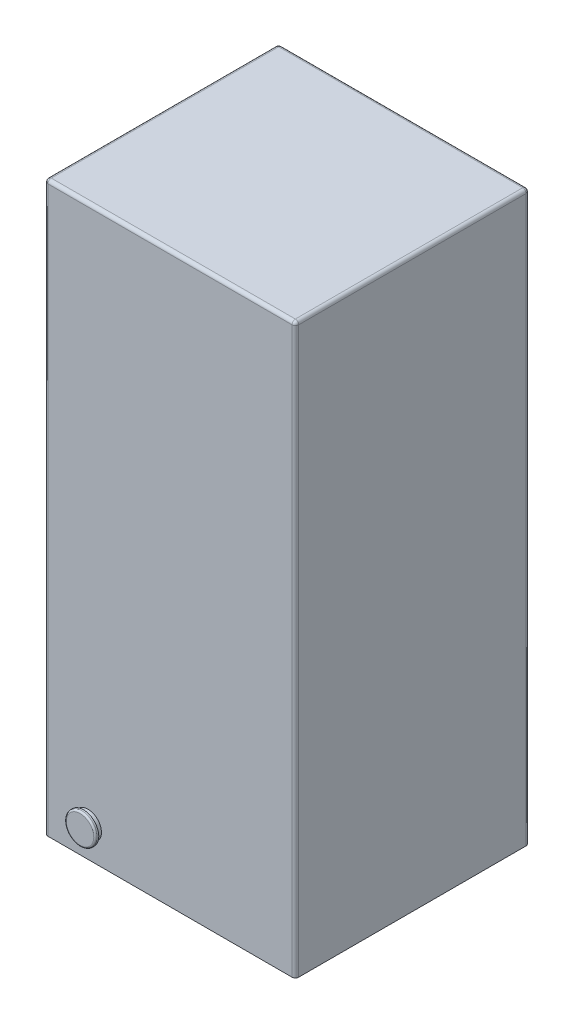
ISO-10303-21;
HEADER;
FILE_DESCRIPTION(('STEP AP214'),'2;1');
FILE_NAME('part.step','',(''),(''),'','','');
FILE_SCHEMA(('AUTOMOTIVE_DESIGN { 1 0 10303 214 1 1 1 1 }'));
ENDSEC;
DATA;
#1=APPLICATION_CONTEXT('core data for automotive mechanical design processes');
#2=APPLICATION_PROTOCOL_DEFINITION('international standard','automotive_design',2000,#1);
#3=PRODUCT_CONTEXT('',#1,'mechanical');
#4=PRODUCT('Part','Part','',(#3));
#5=PRODUCT_RELATED_PRODUCT_CATEGORY('part','',(#4));
#6=PRODUCT_DEFINITION_FORMATION('','',#4);
#7=PRODUCT_DEFINITION_CONTEXT('part definition',#1,'design');
#8=PRODUCT_DEFINITION('design','',#6,#7);
#9=PRODUCT_DEFINITION_SHAPE('','',#8);
#10=(LENGTH_UNIT() NAMED_UNIT(*) SI_UNIT(.MILLI.,.METRE.));
#11=(NAMED_UNIT(*) PLANE_ANGLE_UNIT() SI_UNIT($,.RADIAN.));
#12=(NAMED_UNIT(*) SI_UNIT($,.STERADIAN.) SOLID_ANGLE_UNIT());
#13=UNCERTAINTY_MEASURE_WITH_UNIT(LENGTH_MEASURE(1.E-05),#10,'distance_accuracy_value','');
#14=(GEOMETRIC_REPRESENTATION_CONTEXT(3) GLOBAL_UNCERTAINTY_ASSIGNED_CONTEXT((#13)) GLOBAL_UNIT_ASSIGNED_CONTEXT((#10,
#11,#12)) REPRESENTATION_CONTEXT('',''));
#15=CARTESIAN_POINT('',(0.,0.,0.));
#16=DIRECTION('',(0.,0.,1.));
#17=DIRECTION('',(1.,0.,0.));
#18=AXIS2_PLACEMENT_3D('',#15,#16,#17);
#19=CARTESIAN_POINT('',(130.,-1610.,724.));
#20=DIRECTION('',(0.,0.,-1.));
#21=DIRECTION('',(-1.,0.,0.));
#22=AXIS2_PLACEMENT_3D('',#19,#20,#21);
#23=CYLINDRICAL_SURFACE('',#22,40.);
#24=CARTESIAN_POINT('',(130.,-1610.,700.));
#25=DIRECTION('',(0.,0.,1.));
#26=DIRECTION('',(1.,0.,0.));
#27=AXIS2_PLACEMENT_3D('',#24,#25,#26);
#28=CIRCLE('',#27,40.);
#29=CARTESIAN_POINT('',(170.,-1610.,700.));
#30=VERTEX_POINT('',#29);
#31=EDGE_CURVE('E177',#30,#30,#28,.T.);
#32=ORIENTED_EDGE('',*,*,#31,.T.);
#33=EDGE_LOOP('',(#32));
#34=FACE_BOUND('',#33,.T.);
#35=CARTESIAN_POINT('',(130.,-1610.,714.));
#36=DIRECTION('',(0.,0.,1.));
#37=DIRECTION('',(1.,0.,0.));
#38=AXIS2_PLACEMENT_3D('',#35,#36,#37);
#39=CIRCLE('',#38,40.);
#40=CARTESIAN_POINT('',(170.,-1610.,714.));
#41=VERTEX_POINT('',#40);
#42=EDGE_CURVE('E172',#41,#41,#39,.T.);
#43=ORIENTED_EDGE('',*,*,#42,.F.);
#44=EDGE_LOOP('',(#43));
#45=FACE_BOUND('',#44,.T.);
#46=ADVANCED_FACE('F36',(#34,#45),#23,.T.);
#47=CARTESIAN_POINT('',(0.,0.,700.));
#48=DIRECTION('',(1.,0.,0.));
#49=DIRECTION('',(0.,1.,0.));
#50=AXIS2_PLACEMENT_3D('',#47,#48,#49);
#51=PLANE('',#50);
#52=DIRECTION('',(0.,0.,-1.));
#53=VECTOR('',#52,1.);
#54=CARTESIAN_POINT('',(0.,-10.,700.));
#55=LINE('',#54,#53);
#56=CARTESIAN_POINT('',(0.,-10.,690.));
#57=VERTEX_POINT('',#56);
#58=CARTESIAN_POINT('',(0.,-10.,10.));
#59=VERTEX_POINT('',#58);
#60=EDGE_CURVE('E137',#57,#59,#55,.T.);
#61=ORIENTED_EDGE('',*,*,#60,.T.);
#62=DIRECTION('',(0.,-1.,0.));
#63=VECTOR('',#62,1.);
#64=CARTESIAN_POINT('',(0.,0.,10.));
#65=LINE('',#64,#63);
#66=CARTESIAN_POINT('',(2.0818995585505E-13,-1700.,10.));
#67=VERTEX_POINT('',#66);
#68=EDGE_CURVE('E130',#59,#67,#65,.T.);
#69=ORIENTED_EDGE('',*,*,#68,.T.);
#70=DIRECTION('',(0.,0.,-1.));
#71=VECTOR('',#70,1.);
#72=CARTESIAN_POINT('',(2.0818995585505E-13,-1700.,700.));
#73=LINE('',#72,#71);
#74=CARTESIAN_POINT('',(2.0818995585505E-13,-1700.,690.));
#75=VERTEX_POINT('',#74);
#76=EDGE_CURVE('E117',#75,#67,#73,.T.);
#77=ORIENTED_EDGE('',*,*,#76,.F.);
#78=DIRECTION('',(0.,-1.,0.));
#79=VECTOR('',#78,1.);
#80=CARTESIAN_POINT('',(0.,0.,690.));
#81=LINE('',#80,#79);
#82=EDGE_CURVE('E127',#75,#57,#81,.F.);
#83=ORIENTED_EDGE('',*,*,#82,.T.);
#84=EDGE_LOOP('',(#61,#69,#77,#83));
#85=FACE_BOUND('',#84,.T.);
#86=ADVANCED_FACE('F126',(#85),#51,.F.);
#87=CARTESIAN_POINT('',(2.0818995585505E-13,-1700.,700.));
#88=DIRECTION('',(0.,1.,0.));
#89=DIRECTION('',(0.,0.,1.));
#90=AXIS2_PLACEMENT_3D('',#87,#88,#89);
#91=PLANE('',#90);
#92=ORIENTED_EDGE('',*,*,#76,.T.);
#93=CARTESIAN_POINT('',(10.0000000000002,-1700.,10.));
#94=DIRECTION('',(0.,1.,0.));
#95=DIRECTION('',(0.,0.,1.));
#96=AXIS2_PLACEMENT_3D('',#93,#94,#95);
#97=CIRCLE('',#96,10.);
#98=CARTESIAN_POINT('',(10.0000000000002,-1700.,0.));
#99=VERTEX_POINT('',#98);
#100=EDGE_CURVE('E145',#67,#99,#97,.F.);
#101=ORIENTED_EDGE('',*,*,#100,.T.);
#102=DIRECTION('',(1.,0.,0.));
#103=VECTOR('',#102,1.);
#104=CARTESIAN_POINT('',(2.0818995585505E-13,-1700.,0.));
#105=LINE('',#104,#103);
#106=CARTESIAN_POINT('',(740.,-1700.,0.));
#107=VERTEX_POINT('',#106);
#108=EDGE_CURVE('E207',#99,#107,#105,.T.);
#109=ORIENTED_EDGE('',*,*,#108,.T.);
#110=CARTESIAN_POINT('',(740.,-1700.,10.));
#111=DIRECTION('',(0.,1.,0.));
#112=DIRECTION('',(0.,0.,1.));
#113=AXIS2_PLACEMENT_3D('',#110,#111,#112);
#114=CIRCLE('',#113,10.);
#115=CARTESIAN_POINT('',(750.,-1700.,10.));
#116=VERTEX_POINT('',#115);
#117=EDGE_CURVE('E121',#107,#116,#114,.F.);
#118=ORIENTED_EDGE('',*,*,#117,.T.);
#119=DIRECTION('',(0.,0.,-1.));
#120=VECTOR('',#119,1.);
#121=CARTESIAN_POINT('',(750.,-1700.,700.));
#122=LINE('',#121,#120);
#123=CARTESIAN_POINT('',(750.,-1700.,690.));
#124=VERTEX_POINT('',#123);
#125=EDGE_CURVE('E131',#124,#116,#122,.T.);
#126=ORIENTED_EDGE('',*,*,#125,.F.);
#127=CARTESIAN_POINT('',(740.,-1700.,690.));
#128=DIRECTION('',(0.,1.,0.));
#129=DIRECTION('',(0.,0.,1.));
#130=AXIS2_PLACEMENT_3D('',#127,#128,#129);
#131=CIRCLE('',#130,10.);
#132=CARTESIAN_POINT('',(740.,-1700.,700.));
#133=VERTEX_POINT('',#132);
#134=EDGE_CURVE('E122',#124,#133,#131,.F.);
#135=ORIENTED_EDGE('',*,*,#134,.T.);
#136=DIRECTION('',(1.,0.,0.));
#137=VECTOR('',#136,1.);
#138=CARTESIAN_POINT('',(2.0818995585505E-13,-1700.,700.));
#139=LINE('',#138,#137);
#140=CARTESIAN_POINT('',(10.0000000000002,-1700.,700.));
#141=VERTEX_POINT('',#140);
#142=EDGE_CURVE('E118',#141,#133,#139,.T.);
#143=ORIENTED_EDGE('',*,*,#142,.F.);
#144=CARTESIAN_POINT('',(10.0000000000002,-1700.,690.));
#145=DIRECTION('',(0.,1.,0.));
#146=DIRECTION('',(0.,0.,1.));
#147=AXIS2_PLACEMENT_3D('',#144,#145,#146);
#148=CIRCLE('',#147,10.);
#149=EDGE_CURVE('E114',#141,#75,#148,.F.);
#150=ORIENTED_EDGE('',*,*,#149,.T.);
#151=EDGE_LOOP('',(#92,#101,#109,#118,#126,#135,#143,#150));
#152=FACE_BOUND('',#151,.T.);
#153=ADVANCED_FACE('F116',(#152),#91,.F.);
#154=CARTESIAN_POINT('',(750.,0.,700.));
#155=DIRECTION('',(-1.,0.,0.));
#156=DIRECTION('',(0.,-1.,0.));
#157=AXIS2_PLACEMENT_3D('',#154,#155,#156);
#158=PLANE('',#157);
#159=ORIENTED_EDGE('',*,*,#125,.T.);
#160=DIRECTION('',(0.,1.,0.));
#161=VECTOR('',#160,1.);
#162=CARTESIAN_POINT('',(750.,0.,10.));
#163=LINE('',#162,#161);
#164=CARTESIAN_POINT('',(750.,-10.,10.));
#165=VERTEX_POINT('',#164);
#166=EDGE_CURVE('E166',#116,#165,#163,.T.);
#167=ORIENTED_EDGE('',*,*,#166,.T.);
#168=DIRECTION('',(0.,0.,-1.));
#169=VECTOR('',#168,1.);
#170=CARTESIAN_POINT('',(750.,-10.,700.));
#171=LINE('',#170,#169);
#172=CARTESIAN_POINT('',(750.,-10.,690.));
#173=VERTEX_POINT('',#172);
#174=EDGE_CURVE('E164',#165,#173,#171,.F.);
#175=ORIENTED_EDGE('',*,*,#174,.T.);
#176=DIRECTION('',(0.,1.,0.));
#177=VECTOR('',#176,1.);
#178=CARTESIAN_POINT('',(750.,-1700.,690.));
#179=LINE('',#178,#177);
#180=EDGE_CURVE('E162',#173,#124,#179,.F.);
#181=ORIENTED_EDGE('',*,*,#180,.T.);
#182=EDGE_LOOP('',(#159,#167,#175,#181));
#183=FACE_BOUND('',#182,.T.);
#184=ADVANCED_FACE('F245',(#183),#158,.F.);
#185=CARTESIAN_POINT('',(0.,0.,700.));
#186=DIRECTION('',(0.,-1.,0.));
#187=DIRECTION('',(0.,0.,-1.));
#188=AXIS2_PLACEMENT_3D('',#185,#186,#187);
#189=PLANE('',#188);
#190=DIRECTION('',(0.,0.,-1.));
#191=VECTOR('',#190,1.);
#192=CARTESIAN_POINT('',(740.,0.,700.));
#193=LINE('',#192,#191);
#194=CARTESIAN_POINT('',(740.,0.,690.));
#195=VERTEX_POINT('',#194);
#196=CARTESIAN_POINT('',(740.,0.,10.));
#197=VERTEX_POINT('',#196);
#198=EDGE_CURVE('E153',#195,#197,#193,.T.);
#199=ORIENTED_EDGE('',*,*,#198,.T.);
#200=DIRECTION('',(-1.,0.,0.));
#201=VECTOR('',#200,1.);
#202=CARTESIAN_POINT('',(0.,0.,10.));
#203=LINE('',#202,#201);
#204=CARTESIAN_POINT('',(10.,0.,10.));
#205=VERTEX_POINT('',#204);
#206=EDGE_CURVE('E159',#197,#205,#203,.T.);
#207=ORIENTED_EDGE('',*,*,#206,.T.);
#208=DIRECTION('',(0.,0.,-1.));
#209=VECTOR('',#208,1.);
#210=CARTESIAN_POINT('',(10.,0.,700.));
#211=LINE('',#210,#209);
#212=CARTESIAN_POINT('',(10.,0.,690.));
#213=VERTEX_POINT('',#212);
#214=EDGE_CURVE('E157',#205,#213,#211,.F.);
#215=ORIENTED_EDGE('',*,*,#214,.T.);
#216=DIRECTION('',(-1.,0.,0.));
#217=VECTOR('',#216,1.);
#218=CARTESIAN_POINT('',(750.,0.,690.));
#219=LINE('',#218,#217);
#220=EDGE_CURVE('E155',#213,#195,#219,.F.);
#221=ORIENTED_EDGE('',*,*,#220,.T.);
#222=EDGE_LOOP('',(#199,#207,#215,#221));
#223=FACE_BOUND('',#222,.T.);
#224=ADVANCED_FACE('F237',(#223),#189,.F.);
#225=CARTESIAN_POINT('',(0.,0.,700.));
#226=DIRECTION('',(0.,0.,1.));
#227=DIRECTION('',(1.,0.,0.));
#228=AXIS2_PLACEMENT_3D('',#225,#226,#227);
#229=PLANE('',#228);
#230=ORIENTED_EDGE('',*,*,#31,.F.);
#231=EDGE_LOOP('',(#230));
#232=FACE_BOUND('',#231,.T.);
#233=DIRECTION('',(-1.,0.,0.));
#234=VECTOR('',#233,1.);
#235=CARTESIAN_POINT('',(0.,-10.,700.));
#236=LINE('',#235,#234);
#237=CARTESIAN_POINT('',(740.,-10.,700.));
#238=VERTEX_POINT('',#237);
#239=CARTESIAN_POINT('',(10.,-10.,700.));
#240=VERTEX_POINT('',#239);
#241=EDGE_CURVE('E51',#238,#240,#236,.T.);
#242=ORIENTED_EDGE('',*,*,#241,.T.);
#243=DIRECTION('',(0.,-1.,0.));
#244=VECTOR('',#243,1.);
#245=CARTESIAN_POINT('',(10.0000000000002,-1700.,700.));
#246=LINE('',#245,#244);
#247=EDGE_CURVE('E170',#240,#141,#246,.T.);
#248=ORIENTED_EDGE('',*,*,#247,.T.);
#249=ORIENTED_EDGE('',*,*,#142,.T.);
#250=DIRECTION('',(0.,1.,0.));
#251=VECTOR('',#250,1.);
#252=CARTESIAN_POINT('',(740.,0.,700.));
#253=LINE('',#252,#251);
#254=EDGE_CURVE('E56',#133,#238,#253,.T.);
#255=ORIENTED_EDGE('',*,*,#254,.T.);
#256=EDGE_LOOP('',(#242,#248,#249,#255));
#257=FACE_BOUND('',#256,.T.);
#258=ADVANCED_FACE('F233',(#232,#257),#229,.T.);
#259=CARTESIAN_POINT('',(0.,0.,0.));
#260=DIRECTION('',(0.,0.,1.));
#261=DIRECTION('',(1.,0.,0.));
#262=AXIS2_PLACEMENT_3D('',#259,#260,#261);
#263=PLANE('',#262);
#264=ORIENTED_EDGE('',*,*,#108,.F.);
#265=DIRECTION('',(0.,-1.,0.));
#266=VECTOR('',#265,1.);
#267=CARTESIAN_POINT('',(10.,0.,0.));
#268=LINE('',#267,#266);
#269=CARTESIAN_POINT('',(10.,-10.,0.));
#270=VERTEX_POINT('',#269);
#271=EDGE_CURVE('E151',#99,#270,#268,.F.);
#272=ORIENTED_EDGE('',*,*,#271,.T.);
#273=DIRECTION('',(-1.,0.,0.));
#274=VECTOR('',#273,1.);
#275=CARTESIAN_POINT('',(0.,-10.,0.));
#276=LINE('',#275,#274);
#277=CARTESIAN_POINT('',(740.,-10.,0.));
#278=VERTEX_POINT('',#277);
#279=EDGE_CURVE('E149',#270,#278,#276,.F.);
#280=ORIENTED_EDGE('',*,*,#279,.T.);
#281=DIRECTION('',(0.,1.,0.));
#282=VECTOR('',#281,1.);
#283=CARTESIAN_POINT('',(740.,0.,0.));
#284=LINE('',#283,#282);
#285=EDGE_CURVE('E147',#278,#107,#284,.F.);
#286=ORIENTED_EDGE('',*,*,#285,.T.);
#287=EDGE_LOOP('',(#264,#272,#280,#286));
#288=FACE_BOUND('',#287,.T.);
#289=ADVANCED_FACE('F236',(#288),#263,.F.);
#290=CARTESIAN_POINT('',(740.,0.,690.));
#291=DIRECTION('',(0.,-1.,0.));
#292=DIRECTION('',(1.,0.,0.));
#293=AXIS2_PLACEMENT_3D('',#290,#291,#292);
#294=CYLINDRICAL_SURFACE('',#293,10.);
#295=CARTESIAN_POINT('',(740.,-10.,690.));
#296=DIRECTION('',(0.,1.,0.));
#297=DIRECTION('',(-1.,0.,0.));
#298=AXIS2_PLACEMENT_3D('',#295,#296,#297);
#299=CIRCLE('',#298,10.);
#300=EDGE_CURVE('E204',#238,#173,#299,.T.);
#301=ORIENTED_EDGE('',*,*,#300,.F.);
#302=ORIENTED_EDGE('',*,*,#254,.F.);
#303=ORIENTED_EDGE('',*,*,#134,.F.);
#304=ORIENTED_EDGE('',*,*,#180,.F.);
#305=EDGE_LOOP('',(#301,#302,#303,#304));
#306=FACE_BOUND('',#305,.T.);
#307=ADVANCED_FACE('F241',(#306),#294,.T.);
#308=CARTESIAN_POINT('',(740.,-10.,690.));
#309=DIRECTION('',(0.,0.,1.));
#310=DIRECTION('',(1.,0.,0.));
#311=AXIS2_PLACEMENT_3D('',#308,#309,#310);
#312=SPHERICAL_SURFACE('',#311,10.);
#313=CARTESIAN_POINT('',(740.,-10.,690.));
#314=DIRECTION('',(1.,0.,0.));
#315=DIRECTION('',(0.,0.,-1.));
#316=AXIS2_PLACEMENT_3D('',#313,#314,#315);
#317=CIRCLE('',#316,10.);
#318=EDGE_CURVE('E198',#238,#195,#317,.F.);
#319=ORIENTED_EDGE('',*,*,#318,.F.);
#320=ORIENTED_EDGE('',*,*,#300,.T.);
#321=CARTESIAN_POINT('',(740.,-10.,690.));
#322=DIRECTION('',(0.,0.,1.));
#323=DIRECTION('',(1.,0.,0.));
#324=AXIS2_PLACEMENT_3D('',#321,#322,#323);
#325=CIRCLE('',#324,10.);
#326=EDGE_CURVE('E201',#195,#173,#325,.F.);
#327=ORIENTED_EDGE('',*,*,#326,.F.);
#328=EDGE_LOOP('',(#319,#320,#327));
#329=FACE_BOUND('',#328,.T.);
#330=ADVANCED_FACE('F290',(#329),#312,.T.);
#331=CARTESIAN_POINT('',(740.,0.,10.));
#332=DIRECTION('',(0.,1.,0.));
#333=DIRECTION('',(-1.,0.,0.));
#334=AXIS2_PLACEMENT_3D('',#331,#332,#333);
#335=CYLINDRICAL_SURFACE('',#334,10.);
#336=ORIENTED_EDGE('',*,*,#117,.F.);
#337=ORIENTED_EDGE('',*,*,#285,.F.);
#338=CARTESIAN_POINT('',(740.,-10.,10.));
#339=DIRECTION('',(0.,1.,0.));
#340=DIRECTION('',(-1.,0.,0.));
#341=AXIS2_PLACEMENT_3D('',#338,#339,#340);
#342=CIRCLE('',#341,10.);
#343=EDGE_CURVE('E195',#165,#278,#342,.T.);
#344=ORIENTED_EDGE('',*,*,#343,.F.);
#345=ORIENTED_EDGE('',*,*,#166,.F.);
#346=EDGE_LOOP('',(#336,#337,#344,#345));
#347=FACE_BOUND('',#346,.T.);
#348=ADVANCED_FACE('F286',(#347),#335,.T.);
#349=CARTESIAN_POINT('',(740.,-10.,700.));
#350=DIRECTION('',(0.,0.,-1.));
#351=DIRECTION('',(-1.,0.,0.));
#352=AXIS2_PLACEMENT_3D('',#349,#350,#351);
#353=CYLINDRICAL_SURFACE('',#352,10.);
#354=ORIENTED_EDGE('',*,*,#326,.T.);
#355=ORIENTED_EDGE('',*,*,#174,.F.);
#356=CARTESIAN_POINT('',(740.,-10.,10.));
#357=DIRECTION('',(0.,0.,-1.));
#358=DIRECTION('',(-1.,0.,0.));
#359=AXIS2_PLACEMENT_3D('',#356,#357,#358);
#360=CIRCLE('',#359,10.);
#361=EDGE_CURVE('E192',#197,#165,#360,.T.);
#362=ORIENTED_EDGE('',*,*,#361,.F.);
#363=ORIENTED_EDGE('',*,*,#198,.F.);
#364=EDGE_LOOP('',(#354,#355,#362,#363));
#365=FACE_BOUND('',#364,.T.);
#366=ADVANCED_FACE('F282',(#365),#353,.T.);
#367=CARTESIAN_POINT('',(0.,-10.,690.));
#368=DIRECTION('',(1.,0.,0.));
#369=DIRECTION('',(0.,0.,-1.));
#370=AXIS2_PLACEMENT_3D('',#367,#368,#369);
#371=CYLINDRICAL_SURFACE('',#370,10.);
#372=ORIENTED_EDGE('',*,*,#318,.T.);
#373=ORIENTED_EDGE('',*,*,#220,.F.);
#374=CARTESIAN_POINT('',(10.,-10.,690.));
#375=DIRECTION('',(-1.,0.,0.));
#376=DIRECTION('',(0.,0.,1.));
#377=AXIS2_PLACEMENT_3D('',#374,#375,#376);
#378=CIRCLE('',#377,10.);
#379=EDGE_CURVE('E189',#240,#213,#378,.T.);
#380=ORIENTED_EDGE('',*,*,#379,.F.);
#381=ORIENTED_EDGE('',*,*,#241,.F.);
#382=EDGE_LOOP('',(#372,#373,#380,#381));
#383=FACE_BOUND('',#382,.T.);
#384=ADVANCED_FACE('F279',(#383),#371,.T.);
#385=CARTESIAN_POINT('',(10.,0.,690.));
#386=DIRECTION('',(0.,1.,0.));
#387=DIRECTION('',(-1.,0.,0.));
#388=AXIS2_PLACEMENT_3D('',#385,#386,#387);
#389=CYLINDRICAL_SURFACE('',#388,10.);
#390=ORIENTED_EDGE('',*,*,#149,.F.);
#391=ORIENTED_EDGE('',*,*,#247,.F.);
#392=CARTESIAN_POINT('',(10.,-10.,690.));
#393=DIRECTION('',(0.,1.,0.));
#394=DIRECTION('',(-1.,0.,0.));
#395=AXIS2_PLACEMENT_3D('',#392,#393,#394);
#396=CIRCLE('',#395,10.);
#397=EDGE_CURVE('E135',#57,#240,#396,.T.);
#398=ORIENTED_EDGE('',*,*,#397,.F.);
#399=ORIENTED_EDGE('',*,*,#82,.F.);
#400=EDGE_LOOP('',(#390,#391,#398,#399));
#401=FACE_BOUND('',#400,.T.);
#402=ADVANCED_FACE('F133',(#401),#389,.T.);
#403=CARTESIAN_POINT('',(740.,-10.,10.));
#404=DIRECTION('',(0.,0.,1.));
#405=DIRECTION('',(1.,0.,0.));
#406=AXIS2_PLACEMENT_3D('',#403,#404,#405);
#407=SPHERICAL_SURFACE('',#406,10.);
#408=ORIENTED_EDGE('',*,*,#361,.T.);
#409=ORIENTED_EDGE('',*,*,#343,.T.);
#410=CARTESIAN_POINT('',(740.,-10.,10.));
#411=DIRECTION('',(1.,0.,0.));
#412=DIRECTION('',(0.,0.,-1.));
#413=AXIS2_PLACEMENT_3D('',#410,#411,#412);
#414=CIRCLE('',#413,10.);
#415=EDGE_CURVE('E185',#197,#278,#414,.F.);
#416=ORIENTED_EDGE('',*,*,#415,.F.);
#417=EDGE_LOOP('',(#408,#409,#416));
#418=FACE_BOUND('',#417,.T.);
#419=ADVANCED_FACE('F272',(#418),#407,.T.);
#420=CARTESIAN_POINT('',(10.,-10.,690.));
#421=DIRECTION('',(0.,0.,1.));
#422=DIRECTION('',(1.,0.,0.));
#423=AXIS2_PLACEMENT_3D('',#420,#421,#422);
#424=SPHERICAL_SURFACE('',#423,10.);
#425=ORIENTED_EDGE('',*,*,#397,.T.);
#426=ORIENTED_EDGE('',*,*,#379,.T.);
#427=CARTESIAN_POINT('',(10.,-10.,690.));
#428=DIRECTION('',(0.,0.,1.));
#429=DIRECTION('',(1.,0.,0.));
#430=AXIS2_PLACEMENT_3D('',#427,#428,#429);
#431=CIRCLE('',#430,10.);
#432=EDGE_CURVE('E182',#57,#213,#431,.F.);
#433=ORIENTED_EDGE('',*,*,#432,.F.);
#434=EDGE_LOOP('',(#425,#426,#433));
#435=FACE_BOUND('',#434,.T.);
#436=ADVANCED_FACE('F268',(#435),#424,.T.);
#437=CARTESIAN_POINT('',(0.,-10.,10.));
#438=DIRECTION('',(-1.,0.,0.));
#439=DIRECTION('',(0.,0.,1.));
#440=AXIS2_PLACEMENT_3D('',#437,#438,#439);
#441=CYLINDRICAL_SURFACE('',#440,10.);
#442=ORIENTED_EDGE('',*,*,#415,.T.);
#443=ORIENTED_EDGE('',*,*,#279,.F.);
#444=CARTESIAN_POINT('',(10.,-10.,10.));
#445=DIRECTION('',(-1.,0.,0.));
#446=DIRECTION('',(0.,0.,1.));
#447=AXIS2_PLACEMENT_3D('',#444,#445,#446);
#448=CIRCLE('',#447,10.);
#449=EDGE_CURVE('E179',#205,#270,#448,.T.);
#450=ORIENTED_EDGE('',*,*,#449,.F.);
#451=ORIENTED_EDGE('',*,*,#206,.F.);
#452=EDGE_LOOP('',(#442,#443,#450,#451));
#453=FACE_BOUND('',#452,.T.);
#454=ADVANCED_FACE('F264',(#453),#441,.T.);
#455=CARTESIAN_POINT('',(10.,-10.,700.));
#456=DIRECTION('',(0.,0.,-1.));
#457=DIRECTION('',(-1.,0.,0.));
#458=AXIS2_PLACEMENT_3D('',#455,#456,#457);
#459=CYLINDRICAL_SURFACE('',#458,10.);
#460=ORIENTED_EDGE('',*,*,#432,.T.);
#461=ORIENTED_EDGE('',*,*,#214,.F.);
#462=CARTESIAN_POINT('',(10.,-10.,10.));
#463=DIRECTION('',(0.,0.,-1.));
#464=DIRECTION('',(-1.,0.,0.));
#465=AXIS2_PLACEMENT_3D('',#462,#463,#464);
#466=CIRCLE('',#465,10.);
#467=EDGE_CURVE('E176',#59,#205,#466,.T.);
#468=ORIENTED_EDGE('',*,*,#467,.F.);
#469=ORIENTED_EDGE('',*,*,#60,.F.);
#470=EDGE_LOOP('',(#460,#461,#468,#469));
#471=FACE_BOUND('',#470,.T.);
#472=ADVANCED_FACE('F260',(#471),#459,.T.);
#473=CARTESIAN_POINT('',(10.,-10.,10.));
#474=DIRECTION('',(0.,0.,1.));
#475=DIRECTION('',(1.,0.,0.));
#476=AXIS2_PLACEMENT_3D('',#473,#474,#475);
#477=SPHERICAL_SURFACE('',#476,10.);
#478=ORIENTED_EDGE('',*,*,#467,.T.);
#479=ORIENTED_EDGE('',*,*,#449,.T.);
#480=CARTESIAN_POINT('',(10.,-10.,10.));
#481=DIRECTION('',(0.,1.,0.));
#482=DIRECTION('',(-1.,0.,0.));
#483=AXIS2_PLACEMENT_3D('',#480,#481,#482);
#484=CIRCLE('',#483,10.);
#485=EDGE_CURVE('E173',#59,#270,#484,.F.);
#486=ORIENTED_EDGE('',*,*,#485,.F.);
#487=EDGE_LOOP('',(#478,#479,#486));
#488=FACE_BOUND('',#487,.T.);
#489=ADVANCED_FACE('F256',(#488),#477,.T.);
#490=CARTESIAN_POINT('',(10.,0.,10.));
#491=DIRECTION('',(0.,-1.,0.));
#492=DIRECTION('',(1.,0.,0.));
#493=AXIS2_PLACEMENT_3D('',#490,#491,#492);
#494=CYLINDRICAL_SURFACE('',#493,10.);
#495=ORIENTED_EDGE('',*,*,#485,.T.);
#496=ORIENTED_EDGE('',*,*,#271,.F.);
#497=ORIENTED_EDGE('',*,*,#100,.F.);
#498=ORIENTED_EDGE('',*,*,#68,.F.);
#499=EDGE_LOOP('',(#495,#496,#497,#498));
#500=FACE_BOUND('',#499,.T.);
#501=ADVANCED_FACE('F252',(#500),#494,.T.);
#502=CARTESIAN_POINT('',(130.,-1610.,714.));
#503=DIRECTION('',(0.,0.,1.));
#504=DIRECTION('',(1.,0.,0.));
#505=AXIS2_PLACEMENT_3D('',#502,#503,#504);
#506=CYLINDRICAL_SURFACE('',#505,46.0000000000001);
#507=CARTESIAN_POINT('',(130.,-1610.,719.));
#508=DIRECTION('',(0.,0.,1.));
#509=DIRECTION('',(1.,0.,0.));
#510=AXIS2_PLACEMENT_3D('',#507,#508,#509);
#511=CIRCLE('',#510,46.0000000000001);
#512=CARTESIAN_POINT('',(176.,-1610.,719.));
#513=VERTEX_POINT('',#512);
#514=EDGE_CURVE('E11',#513,#513,#511,.F.);
#515=ORIENTED_EDGE('',*,*,#514,.T.);
#516=EDGE_LOOP('',(#515));
#517=FACE_BOUND('',#516,.T.);
#518=CARTESIAN_POINT('',(130.,-1610.,714.));
#519=DIRECTION('',(0.,0.,1.));
#520=DIRECTION('',(1.,0.,0.));
#521=AXIS2_PLACEMENT_3D('',#518,#519,#520);
#522=CIRCLE('',#521,46.0000000000001);
#523=CARTESIAN_POINT('',(176.,-1610.,714.));
#524=VERTEX_POINT('',#523);
#525=EDGE_CURVE('E328',#524,#524,#522,.T.);
#526=ORIENTED_EDGE('',*,*,#525,.T.);
#527=EDGE_LOOP('',(#526));
#528=FACE_BOUND('',#527,.T.);
#529=ADVANCED_FACE('F255',(#517,#528),#506,.T.);
#530=CARTESIAN_POINT('',(130.,-1610.,714.));
#531=DIRECTION('',(0.,0.,1.));
#532=DIRECTION('',(1.,0.,0.));
#533=AXIS2_PLACEMENT_3D('',#530,#531,#532);
#534=PLANE('',#533);
#535=ORIENTED_EDGE('',*,*,#42,.T.);
#536=EDGE_LOOP('',(#535));
#537=FACE_BOUND('',#536,.T.);
#538=ORIENTED_EDGE('',*,*,#525,.F.);
#539=EDGE_LOOP('',(#538));
#540=FACE_BOUND('',#539,.T.);
#541=ADVANCED_FACE('F219',(#537,#540),#534,.F.);
#542=CARTESIAN_POINT('',(130.,-1610.,724.));
#543=DIRECTION('',(0.,0.,1.));
#544=DIRECTION('',(1.,0.,0.));
#545=AXIS2_PLACEMENT_3D('',#542,#543,#544);
#546=PLANE('',#545);
#547=CARTESIAN_POINT('',(130.,-1610.,724.));
#548=DIRECTION('',(0.,0.,1.));
#549=DIRECTION('',(1.,0.,0.));
#550=AXIS2_PLACEMENT_3D('',#547,#548,#549);
#551=CIRCLE('',#550,41.0000000000001);
#552=CARTESIAN_POINT('',(171.,-1610.,724.));
#553=VERTEX_POINT('',#552);
#554=EDGE_CURVE('E44',#553,#553,#551,.T.);
#555=ORIENTED_EDGE('',*,*,#554,.T.);
#556=EDGE_LOOP('',(#555));
#557=FACE_BOUND('',#556,.T.);
#558=ADVANCED_FACE('F212',(#557),#546,.T.);
#559=CARTESIAN_POINT('',(130.,-1610.,719.));
#560=DIRECTION('',(0.,0.,1.));
#561=DIRECTION('',(1.,0.,0.));
#562=AXIS2_PLACEMENT_3D('',#559,#560,#561);
#563=TOROIDAL_SURFACE('',#562,41.0000000000001,5.);
#564=ORIENTED_EDGE('',*,*,#514,.F.);
#565=EDGE_LOOP('',(#564));
#566=FACE_BOUND('',#565,.T.);
#567=ORIENTED_EDGE('',*,*,#554,.F.);
#568=EDGE_LOOP('',(#567));
#569=FACE_BOUND('',#568,.T.);
#570=ADVANCED_FACE('F38',(#566,#569),#563,.T.);
#571=CLOSED_SHELL('',(#46,#86,#153,#184,#224,#258,#289,#307,#330,#348,#366,#384,#402,#419,#436,
#454,#472,#489,#501,#529,#541,#558,#570));
#572=MANIFOLD_SOLID_BREP('B2',#571);
#573=ADVANCED_BREP_SHAPE_REPRESENTATION('',(#18,#572),#14);
#574=SHAPE_DEFINITION_REPRESENTATION(#9,#573);
ENDSEC;
END-ISO-10303-21;
